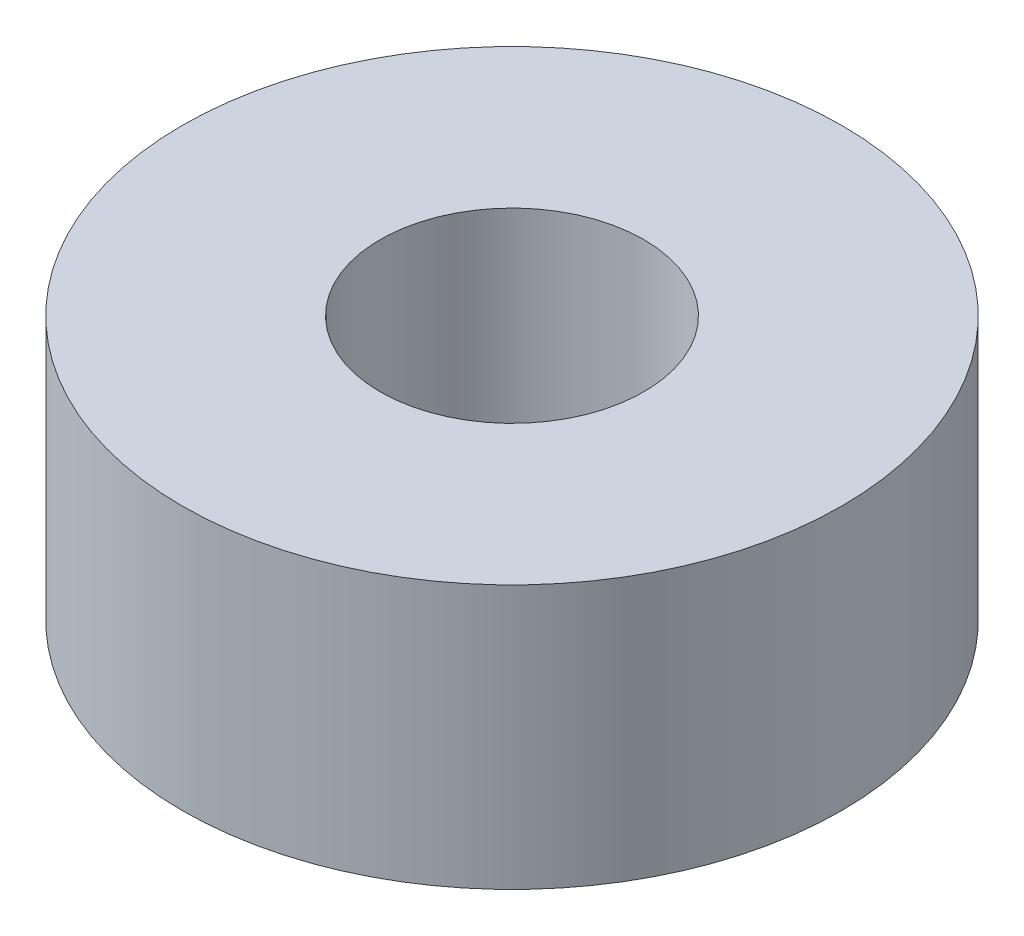
ISO-10303-21;
HEADER;
FILE_DESCRIPTION(('STEP AP214'),'2;1');
FILE_NAME('part.step','',(''),(''),'','','');
FILE_SCHEMA(('AUTOMOTIVE_DESIGN { 1 0 10303 214 1 1 1 1 }'));
ENDSEC;
DATA;
#1=APPLICATION_CONTEXT('core data for automotive mechanical design processes');
#2=APPLICATION_PROTOCOL_DEFINITION('international standard','automotive_design',2000,#1);
#3=PRODUCT_CONTEXT('',#1,'mechanical');
#4=PRODUCT('Part','Part','',(#3));
#5=PRODUCT_RELATED_PRODUCT_CATEGORY('part','',(#4));
#6=PRODUCT_DEFINITION_FORMATION('','',#4);
#7=PRODUCT_DEFINITION_CONTEXT('part definition',#1,'design');
#8=PRODUCT_DEFINITION('design','',#6,#7);
#9=PRODUCT_DEFINITION_SHAPE('','',#8);
#10=(LENGTH_UNIT() NAMED_UNIT(*) SI_UNIT(.MILLI.,.METRE.));
#11=(NAMED_UNIT(*) PLANE_ANGLE_UNIT() SI_UNIT($,.RADIAN.));
#12=(NAMED_UNIT(*) SI_UNIT($,.STERADIAN.) SOLID_ANGLE_UNIT());
#13=UNCERTAINTY_MEASURE_WITH_UNIT(LENGTH_MEASURE(1.E-05),#10,'distance_accuracy_value','');
#14=(GEOMETRIC_REPRESENTATION_CONTEXT(3) GLOBAL_UNCERTAINTY_ASSIGNED_CONTEXT((#13)) GLOBAL_UNIT_ASSIGNED_CONTEXT((#10,
#11,#12)) REPRESENTATION_CONTEXT('',''));
#15=CARTESIAN_POINT('',(0.,0.,0.));
#16=DIRECTION('',(0.,0.,1.));
#17=DIRECTION('',(1.,0.,0.));
#18=AXIS2_PLACEMENT_3D('',#15,#16,#17);
#19=CARTESIAN_POINT('',(0.,4.,0.));
#20=DIRECTION('',(0.,1.,0.));
#21=DIRECTION('',(0.,0.,1.));
#22=AXIS2_PLACEMENT_3D('',#19,#20,#21);
#23=PLANE('',#22);
#24=CARTESIAN_POINT('',(0.,4.,0.));
#25=DIRECTION('',(0.,1.,0.));
#26=DIRECTION('',(0.,0.,1.));
#27=AXIS2_PLACEMENT_3D('',#24,#25,#26);
#28=CIRCLE('',#27,5.);
#29=CARTESIAN_POINT('',(0.,4.,5.));
#30=VERTEX_POINT('',#29);
#31=EDGE_CURVE('E10',#30,#30,#28,.T.);
#32=ORIENTED_EDGE('',*,*,#31,.T.);
#33=EDGE_LOOP('',(#32));
#34=FACE_BOUND('',#33,.T.);
#35=CARTESIAN_POINT('',(0.,4.,0.));
#36=DIRECTION('',(0.,1.,0.));
#37=DIRECTION('',(0.,0.,1.));
#38=AXIS2_PLACEMENT_3D('',#35,#36,#37);
#39=CIRCLE('',#38,2.);
#40=CARTESIAN_POINT('',(0.,4.,2.));
#41=VERTEX_POINT('',#40);
#42=EDGE_CURVE('E54',#41,#41,#39,.T.);
#43=ORIENTED_EDGE('',*,*,#42,.F.);
#44=EDGE_LOOP('',(#43));
#45=FACE_BOUND('',#44,.T.);
#46=ADVANCED_FACE('F41',(#34,#45),#23,.T.);
#47=CARTESIAN_POINT('',(0.,0.,0.));
#48=DIRECTION('',(0.,1.,0.));
#49=DIRECTION('',(0.,0.,1.));
#50=AXIS2_PLACEMENT_3D('',#47,#48,#49);
#51=PLANE('',#50);
#52=CARTESIAN_POINT('',(0.,0.,0.));
#53=DIRECTION('',(0.,1.,0.));
#54=DIRECTION('',(0.,0.,1.));
#55=AXIS2_PLACEMENT_3D('',#52,#53,#54);
#56=CIRCLE('',#55,5.);
#57=CARTESIAN_POINT('',(0.,0.,5.));
#58=VERTEX_POINT('',#57);
#59=EDGE_CURVE('E45',#58,#58,#56,.T.);
#60=ORIENTED_EDGE('',*,*,#59,.F.);
#61=EDGE_LOOP('',(#60));
#62=FACE_BOUND('',#61,.T.);
#63=CARTESIAN_POINT('',(0.,0.,0.));
#64=DIRECTION('',(0.,1.,0.));
#65=DIRECTION('',(0.,0.,1.));
#66=AXIS2_PLACEMENT_3D('',#63,#64,#65);
#67=CIRCLE('',#66,2.);
#68=CARTESIAN_POINT('',(0.,0.,2.));
#69=VERTEX_POINT('',#68);
#70=EDGE_CURVE('E56',#69,#69,#67,.T.);
#71=ORIENTED_EDGE('',*,*,#70,.T.);
#72=EDGE_LOOP('',(#71));
#73=FACE_BOUND('',#72,.T.);
#74=ADVANCED_FACE('F68',(#62,#73),#51,.F.);
#75=CARTESIAN_POINT('',(0.,4.,0.));
#76=DIRECTION('',(0.,-1.,0.));
#77=DIRECTION('',(0.,0.,-1.));
#78=AXIS2_PLACEMENT_3D('',#75,#76,#77);
#79=CYLINDRICAL_SURFACE('',#78,5.);
#80=ORIENTED_EDGE('',*,*,#31,.F.);
#81=EDGE_LOOP('',(#80));
#82=FACE_BOUND('',#81,.T.);
#83=ORIENTED_EDGE('',*,*,#59,.T.);
#84=EDGE_LOOP('',(#83));
#85=FACE_BOUND('',#84,.T.);
#86=ADVANCED_FACE('F43',(#82,#85),#79,.T.);
#87=CARTESIAN_POINT('',(0.,4.,0.));
#88=DIRECTION('',(0.,-1.,0.));
#89=DIRECTION('',(0.,0.,-1.));
#90=AXIS2_PLACEMENT_3D('',#87,#88,#89);
#91=CYLINDRICAL_SURFACE('',#90,2.);
#92=ORIENTED_EDGE('',*,*,#42,.T.);
#93=EDGE_LOOP('',(#92));
#94=FACE_BOUND('',#93,.T.);
#95=ORIENTED_EDGE('',*,*,#70,.F.);
#96=EDGE_LOOP('',(#95));
#97=FACE_BOUND('',#96,.T.);
#98=ADVANCED_FACE('F64',(#94,#97),#91,.F.);
#99=CLOSED_SHELL('',(#46,#74,#86,#98));
#100=MANIFOLD_SOLID_BREP('B2',#99);
#101=ADVANCED_BREP_SHAPE_REPRESENTATION('',(#18,#100),#14);
#102=SHAPE_DEFINITION_REPRESENTATION(#9,#101);
ENDSEC;
END-ISO-10303-21;
